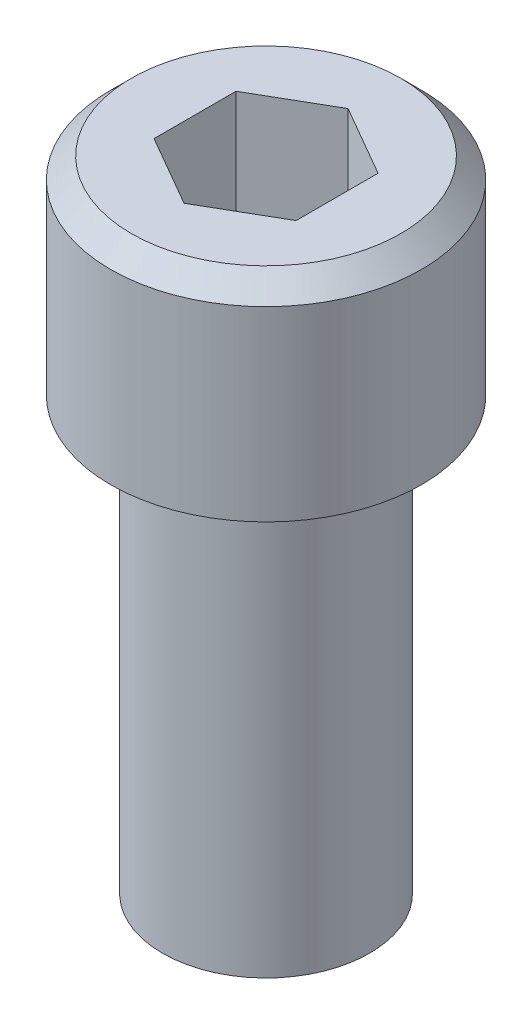
ISO-10303-21;
HEADER;
FILE_DESCRIPTION(('STEP AP214'),'2;1');
FILE_NAME('part.step','',(''),(''),'','','');
FILE_SCHEMA(('AUTOMOTIVE_DESIGN { 1 0 10303 214 1 1 1 1 }'));
ENDSEC;
DATA;
#1=APPLICATION_CONTEXT('core data for automotive mechanical design processes');
#2=APPLICATION_PROTOCOL_DEFINITION('international standard','automotive_design',2000,#1);
#3=PRODUCT_CONTEXT('',#1,'mechanical');
#4=PRODUCT('Part','Part','',(#3));
#5=PRODUCT_RELATED_PRODUCT_CATEGORY('part','',(#4));
#6=PRODUCT_DEFINITION_FORMATION('','',#4);
#7=PRODUCT_DEFINITION_CONTEXT('part definition',#1,'design');
#8=PRODUCT_DEFINITION('design','',#6,#7);
#9=PRODUCT_DEFINITION_SHAPE('','',#8);
#10=(LENGTH_UNIT() NAMED_UNIT(*) SI_UNIT(.MILLI.,.METRE.));
#11=(NAMED_UNIT(*) PLANE_ANGLE_UNIT() SI_UNIT($,.RADIAN.));
#12=(NAMED_UNIT(*) SI_UNIT($,.STERADIAN.) SOLID_ANGLE_UNIT());
#13=UNCERTAINTY_MEASURE_WITH_UNIT(LENGTH_MEASURE(1.E-05),#10,'distance_accuracy_value','');
#14=(GEOMETRIC_REPRESENTATION_CONTEXT(3) GLOBAL_UNCERTAINTY_ASSIGNED_CONTEXT((#13)) GLOBAL_UNIT_ASSIGNED_CONTEXT((#10,
#11,#12)) REPRESENTATION_CONTEXT('',''));
#15=CARTESIAN_POINT('',(0.,0.,0.));
#16=DIRECTION('',(0.,0.,1.));
#17=DIRECTION('',(1.,0.,0.));
#18=AXIS2_PLACEMENT_3D('',#15,#16,#17);
#19=CARTESIAN_POINT('',(0.,0.,0.));
#20=DIRECTION('',(0.,1.,0.));
#21=DIRECTION('',(0.,0.,1.));
#22=AXIS2_PLACEMENT_3D('',#19,#20,#21);
#23=PLANE('',#22);
#24=CARTESIAN_POINT('',(0.,0.,0.));
#25=DIRECTION('',(0.,1.,0.));
#26=DIRECTION('',(0.,0.,1.));
#27=AXIS2_PLACEMENT_3D('',#24,#25,#26);
#28=CIRCLE('',#27,18.);
#29=CARTESIAN_POINT('',(0.,0.,18.));
#30=VERTEX_POINT('',#29);
#31=EDGE_CURVE('E193',#30,#30,#28,.T.);
#32=ORIENTED_EDGE('',*,*,#31,.F.);
#33=EDGE_LOOP('',(#32));
#34=FACE_BOUND('',#33,.T.);
#35=CARTESIAN_POINT('',(0.,0.,0.));
#36=DIRECTION('',(0.,1.,0.));
#37=DIRECTION('',(0.,0.,1.));
#38=AXIS2_PLACEMENT_3D('',#35,#36,#37);
#39=CIRCLE('',#38,12.);
#40=CARTESIAN_POINT('',(0.,0.,12.));
#41=VERTEX_POINT('',#40);
#42=EDGE_CURVE('E11',#41,#41,#39,.F.);
#43=ORIENTED_EDGE('',*,*,#42,.F.);
#44=EDGE_LOOP('',(#43));
#45=FACE_BOUND('',#44,.T.);
#46=ADVANCED_FACE('F33',(#34,#45),#23,.F.);
#47=CARTESIAN_POINT('',(0.,24.,0.));
#48=DIRECTION('',(0.,1.,0.));
#49=DIRECTION('',(0.,0.,1.));
#50=AXIS2_PLACEMENT_3D('',#47,#48,#49);
#51=PLANE('',#50);
#52=CARTESIAN_POINT('',(0.,24.,0.));
#53=DIRECTION('',(0.,1.,0.));
#54=DIRECTION('',(0.,0.,1.));
#55=AXIS2_PLACEMENT_3D('',#52,#53,#54);
#56=CIRCLE('',#55,15.6);
#57=CARTESIAN_POINT('',(0.,24.,15.6));
#58=VERTEX_POINT('',#57);
#59=EDGE_CURVE('E106',#58,#58,#56,.T.);
#60=ORIENTED_EDGE('',*,*,#59,.T.);
#61=EDGE_LOOP('',(#60));
#62=FACE_BOUND('',#61,.T.);
#63=DIRECTION('',(-0.866025403784439,0.,0.5));
#64=VECTOR('',#63,1.);
#65=CARTESIAN_POINT('',(0.,24.,-9.5));
#66=LINE('',#65,#64);
#67=CARTESIAN_POINT('',(0.,24.,-9.5));
#68=VERTEX_POINT('',#67);
#69=CARTESIAN_POINT('',(-8.22724133595217,24.,-4.75));
#70=VERTEX_POINT('',#69);
#71=EDGE_CURVE('E169',#68,#70,#66,.T.);
#72=ORIENTED_EDGE('',*,*,#71,.F.);
#73=DIRECTION('',(-0.866025403784439,0.,-0.5));
#74=VECTOR('',#73,1.);
#75=CARTESIAN_POINT('',(8.22724133595217,24.,-4.75));
#76=LINE('',#75,#74);
#77=CARTESIAN_POINT('',(8.22724133595217,24.,-4.75));
#78=VERTEX_POINT('',#77);
#79=EDGE_CURVE('E167',#78,#68,#76,.T.);
#80=ORIENTED_EDGE('',*,*,#79,.F.);
#81=DIRECTION('',(0.,0.,-1.));
#82=VECTOR('',#81,1.);
#83=CARTESIAN_POINT('',(8.22724133595217,24.,4.75));
#84=LINE('',#83,#82);
#85=CARTESIAN_POINT('',(8.22724133595217,24.,4.75));
#86=VERTEX_POINT('',#85);
#87=EDGE_CURVE('E178',#86,#78,#84,.T.);
#88=ORIENTED_EDGE('',*,*,#87,.F.);
#89=DIRECTION('',(0.866025403784439,0.,-0.5));
#90=VECTOR('',#89,1.);
#91=CARTESIAN_POINT('',(0.,24.,9.5));
#92=LINE('',#91,#90);
#93=CARTESIAN_POINT('',(0.,24.,9.5));
#94=VERTEX_POINT('',#93);
#95=EDGE_CURVE('E175',#94,#86,#92,.T.);
#96=ORIENTED_EDGE('',*,*,#95,.F.);
#97=DIRECTION('',(0.866025403784439,0.,0.5));
#98=VECTOR('',#97,1.);
#99=CARTESIAN_POINT('',(-8.22724133595217,24.,4.75));
#100=LINE('',#99,#98);
#101=CARTESIAN_POINT('',(-8.22724133595217,24.,4.75));
#102=VERTEX_POINT('',#101);
#103=EDGE_CURVE('E173',#102,#94,#100,.T.);
#104=ORIENTED_EDGE('',*,*,#103,.F.);
#105=DIRECTION('',(0.,0.,1.));
#106=VECTOR('',#105,1.);
#107=CARTESIAN_POINT('',(-8.22724133595217,24.,-4.75));
#108=LINE('',#107,#106);
#109=EDGE_CURVE('E171',#70,#102,#108,.T.);
#110=ORIENTED_EDGE('',*,*,#109,.F.);
#111=EDGE_LOOP('',(#72,#80,#88,#96,#104,#110));
#112=FACE_BOUND('',#111,.T.);
#113=ADVANCED_FACE('F161',(#62,#112),#51,.T.);
#114=CARTESIAN_POINT('',(0.,24.,0.));
#115=DIRECTION('',(0.,-1.,0.));
#116=DIRECTION('',(0.,0.,-1.));
#117=AXIS2_PLACEMENT_3D('',#114,#115,#116);
#118=CYLINDRICAL_SURFACE('',#117,18.);
#119=CARTESIAN_POINT('',(0.,21.6,0.));
#120=DIRECTION('',(0.,1.,0.));
#121=DIRECTION('',(0.,0.,1.));
#122=AXIS2_PLACEMENT_3D('',#119,#120,#121);
#123=CIRCLE('',#122,18.);
#124=CARTESIAN_POINT('',(0.,21.6,18.));
#125=VERTEX_POINT('',#124);
#126=EDGE_CURVE('E104',#125,#125,#123,.F.);
#127=ORIENTED_EDGE('',*,*,#126,.T.);
#128=EDGE_LOOP('',(#127));
#129=FACE_BOUND('',#128,.T.);
#130=ORIENTED_EDGE('',*,*,#31,.T.);
#131=EDGE_LOOP('',(#130));
#132=FACE_BOUND('',#131,.T.);
#133=ADVANCED_FACE('F159',(#129,#132),#118,.T.);
#134=CARTESIAN_POINT('',(8.22724133595217,24.,-4.75));
#135=DIRECTION('',(-0.5,0.,0.866025403784439));
#136=DIRECTION('',(0.866025403784439,0.,0.5));
#137=AXIS2_PLACEMENT_3D('',#134,#135,#136);
#138=PLANE('',#137);
#139=CARTESIAN_POINT('',(8.22744133595217,12.0000666678821,-4.74988452994616));
#140=CARTESIAN_POINT('',(8.04659758583466,11.9397948671262,-4.85429471775777));
#141=CARTESIAN_POINT('',(7.86507958622392,11.8822584416015,-4.95909418369579));
#142=CARTESIAN_POINT('',(7.50056942295557,11.7734097386162,-5.16954422458113));
#143=CARTESIAN_POINT('',(7.31757665905111,11.7221001477923,-5.27519514608112));
#144=CARTESIAN_POINT('',(6.76566843893082,11.578518859269,-5.59383950553554));
#145=CARTESIAN_POINT('',(6.39457435644526,11.4968517102731,-5.80809077395326));
#146=CARTESIAN_POINT('',(5.83923923489461,11.4010873747825,-6.12871365587097));
#147=CARTESIAN_POINT('',(5.65665723938216,11.3738068904218,-6.23412742012927));
#148=CARTESIAN_POINT('',(5.29066756080364,11.3280621549001,-6.4454316595772));
#149=CARTESIAN_POINT('',(5.10725995213686,11.309597124785,-6.55132209181239));
#150=CARTESIAN_POINT('',(4.7401289375152,11.2819512654669,-6.76328528193206));
#151=CARTESIAN_POINT('',(4.5564061280416,11.2727599000124,-6.86935769543792));
#152=CARTESIAN_POINT('',(4.18879079055541,11.2638584224413,-7.08160050949381));
#153=CARTESIAN_POINT('',(4.00489826796174,11.2641480174048,-7.18777090691522));
#154=CARTESIAN_POINT('',(3.66110464437688,11.2735490043022,-7.38626024803762));
#155=CARTESIAN_POINT('',(3.5011792823305,11.2815136047913,-7.47859319886534));
#156=CARTESIAN_POINT('',(3.18170312063848,11.3044589304397,-7.6630428468179));
#157=CARTESIAN_POINT('',(3.02215234697069,11.3194401285533,-7.75515952894442));
#158=CARTESIAN_POINT('',(2.54411771125834,11.3745545023655,-8.0311529545549));
#159=CARTESIAN_POINT('',(2.22648001075275,11.4248515749206,-8.21454116644658));
#160=CARTESIAN_POINT('',(1.58783516770009,11.5505950920653,-8.5832629384996));
#161=CARTESIAN_POINT('',(1.26690953264391,11.6265745612511,-8.76854944028914));
#162=CARTESIAN_POINT('',(0.629844109224194,11.7990165466259,-9.13635933399191));
#163=CARTESIAN_POINT('',(0.313696162655308,11.8954385604423,-9.31888743604721));
#164=CARTESIAN_POINT('',(-0.000200000000000182,12.0000666678821,-9.50011547005384));
#165=B_SPLINE_CURVE_WITH_KNOTS('',3,(#139,#140,#141,#142,#143,#144,#145,#146,#147,#148,#149,
#150,#151,#152,#153,#154,#155,#156,#157,#158,#159,#160,#161,#162,#163,#164),.UNSPECIFIED.,.F.,
.F.,(4,2,2,2,2,2,2,2,2,2,2,2,4),(0.,0.651981443680323,1.30424319931677,2.61147679303848,
3.24908400419041,3.88663486446454,4.52346055445683,5.16026656936256,5.71464112370344,
6.2690530510783,7.37866663979238,8.5128892932208,9.64488539256863),.UNSPECIFIED.);
#166=CARTESIAN_POINT('',(8.22724133595217,12.,-4.75));
#167=VERTEX_POINT('',#166);
#168=CARTESIAN_POINT('',(0.,12.,-9.5));
#169=VERTEX_POINT('',#168);
#170=EDGE_CURVE('E99',#167,#169,#165,.T.);
#171=ORIENTED_EDGE('',*,*,#170,.F.);
#172=DIRECTION('',(0.,-1.,0.));
#173=VECTOR('',#172,1.);
#174=CARTESIAN_POINT('',(8.22724133595217,24.,-4.75));
#175=LINE('',#174,#173);
#176=EDGE_CURVE('E180',#78,#167,#175,.T.);
#177=ORIENTED_EDGE('',*,*,#176,.F.);
#178=ORIENTED_EDGE('',*,*,#79,.T.);
#179=DIRECTION('',(0.,-1.,0.));
#180=VECTOR('',#179,1.);
#181=CARTESIAN_POINT('',(0.,24.,-9.5));
#182=LINE('',#181,#180);
#183=EDGE_CURVE('E191',#68,#169,#182,.T.);
#184=ORIENTED_EDGE('',*,*,#183,.T.);
#185=EDGE_LOOP('',(#171,#177,#178,#184));
#186=FACE_BOUND('',#185,.T.);
#187=ADVANCED_FACE('F155',(#186),#138,.T.);
#188=CARTESIAN_POINT('',(0.,24.,-9.5));
#189=DIRECTION('',(0.5,0.,0.866025403784439));
#190=DIRECTION('',(0.866025403784439,0.,-0.5));
#191=AXIS2_PLACEMENT_3D('',#188,#189,#190);
#192=PLANE('',#191);
#193=CARTESIAN_POINT('',(0.000199999999999615,12.0000666678821,-9.50011547005384));
#194=CARTESIAN_POINT('',(-0.180643750117506,11.9397948671262,-9.39570528224224));
#195=CARTESIAN_POINT('',(-0.362161749728251,11.8822584416015,-9.29090581630421));
#196=CARTESIAN_POINT('',(-0.726671912996597,11.7734097386162,-9.08045577541887));
#197=CARTESIAN_POINT('',(-0.909664676901062,11.7221001477923,-8.97480485391888));
#198=CARTESIAN_POINT('',(-1.46157289702135,11.578518859269,-8.65616049446446));
#199=CARTESIAN_POINT('',(-1.83266697950691,11.4968517102731,-8.44190922604675));
#200=CARTESIAN_POINT('',(-2.38800210105755,11.4010873747825,-8.12128634412903));
#201=CARTESIAN_POINT('',(-2.57058409657001,11.3738068904218,-8.01587257987073));
#202=CARTESIAN_POINT('',(-2.93657377514853,11.3280621549001,-7.8045683404228));
#203=CARTESIAN_POINT('',(-3.1199813838153,11.309597124785,-7.69867790818761));
#204=CARTESIAN_POINT('',(-3.48711239843696,11.2819512654669,-7.48671471806794));
#205=CARTESIAN_POINT('',(-3.67083520791056,11.2727599000124,-7.38064230456208));
#206=CARTESIAN_POINT('',(-4.03845054539675,11.2638584224413,-7.16839949050619));
#207=CARTESIAN_POINT('',(-4.22234306799043,11.2641480174048,-7.06222909308478));
#208=CARTESIAN_POINT('',(-4.56613669157529,11.2735490043022,-6.86373975196238));
#209=CARTESIAN_POINT('',(-4.72606205362167,11.2815136047913,-6.77140680113466));
#210=CARTESIAN_POINT('',(-5.04553821531369,11.3044589304397,-6.5869571531821));
#211=CARTESIAN_POINT('',(-5.20508898898148,11.3194401285533,-6.49484047105559));
#212=CARTESIAN_POINT('',(-5.68312362469383,11.3745545023655,-6.2188470454451));
#213=CARTESIAN_POINT('',(-6.00076132519942,11.4248515749206,-6.03545883355342));
#214=CARTESIAN_POINT('',(-6.63940616825207,11.5505950920653,-5.66673706150041));
#215=CARTESIAN_POINT('',(-6.96033180330825,11.6265745612511,-5.48145055971087));
#216=CARTESIAN_POINT('',(-7.59739722672797,11.7990165466259,-5.11364066600809));
#217=CARTESIAN_POINT('',(-7.91354517329686,11.8954385604423,-4.9311125639528));
#218=CARTESIAN_POINT('',(-8.22744133595217,12.0000666678821,-4.74988452994616));
#219=B_SPLINE_CURVE_WITH_KNOTS('',3,(#193,#194,#195,#196,#197,#198,#199,#200,#201,#202,#203,
#204,#205,#206,#207,#208,#209,#210,#211,#212,#213,#214,#215,#216,#217,#218),.UNSPECIFIED.,.F.,
.F.,(4,2,2,2,2,2,2,2,2,2,2,2,4),(0.,0.651981443680322,1.30424319931677,2.61147679303848,
3.24908400419041,3.88663486446454,4.52346055445683,5.16026656936255,5.71464112370344,
6.2690530510783,7.37866663979238,8.5128892932208,9.64488539256862),.UNSPECIFIED.);
#220=CARTESIAN_POINT('',(-8.22724133595217,12.,-4.75));
#221=VERTEX_POINT('',#220);
#222=EDGE_CURVE('E48',#169,#221,#219,.T.);
#223=ORIENTED_EDGE('',*,*,#222,.F.);
#224=ORIENTED_EDGE('',*,*,#183,.F.);
#225=ORIENTED_EDGE('',*,*,#71,.T.);
#226=DIRECTION('',(0.,-1.,0.));
#227=VECTOR('',#226,1.);
#228=CARTESIAN_POINT('',(-8.22724133595217,24.,-4.75));
#229=LINE('',#228,#227);
#230=EDGE_CURVE('E189',#70,#221,#229,.T.);
#231=ORIENTED_EDGE('',*,*,#230,.T.);
#232=EDGE_LOOP('',(#223,#224,#225,#231));
#233=FACE_BOUND('',#232,.T.);
#234=ADVANCED_FACE('F151',(#233),#192,.T.);
#235=CARTESIAN_POINT('',(-8.22724133595217,24.,-4.75));
#236=DIRECTION('',(1.,0.,0.));
#237=DIRECTION('',(0.,0.,-1.));
#238=AXIS2_PLACEMENT_3D('',#235,#236,#237);
#239=PLANE('',#238);
#240=CARTESIAN_POINT('',(-8.22724133595217,15.0591786598063,-12.3009197507311));
#241=CARTESIAN_POINT('',(-8.22724133595217,14.8887284634204,-11.9456391255625));
#242=CARTESIAN_POINT('',(-8.22724133595217,14.7200486977412,-11.589492996995));
#243=CARTESIAN_POINT('',(-8.22724133595217,14.3872343724134,-10.8750084325189));
#244=CARTESIAN_POINT('',(-8.22724133595217,14.2231006305902,-10.5166696161237));
#245=CARTESIAN_POINT('',(-8.22724133595217,13.8994657493544,-9.79528374053409));
#246=CARTESIAN_POINT('',(-8.22724133595217,13.7399987510733,-9.4322213066883));
#247=CARTESIAN_POINT('',(-8.22724133595217,13.4282156380862,-8.70304991591352));
#248=CARTESIAN_POINT('',(-8.22724133595217,13.2758991517953,-8.33694111845905));
#249=CARTESIAN_POINT('',(-8.22724133595217,12.9764426168056,-7.59145033574089));
#250=CARTESIAN_POINT('',(-8.22724133595217,12.8295420329299,-7.21197158481871));
#251=CARTESIAN_POINT('',(-8.22724133595217,12.5479541645643,-6.44842506321989));
#252=CARTESIAN_POINT('',(-8.22724133595217,12.4132682955595,-6.06435676651184));
#253=CARTESIAN_POINT('',(-8.22724133595217,12.1599565589819,-5.29188533357242));
#254=CARTESIAN_POINT('',(-8.22724133595217,12.0412942292182,-4.90349429282243));
#255=CARTESIAN_POINT('',(-8.22724133595217,11.8241019037623,-4.12119443583158));
#256=CARTESIAN_POINT('',(-8.22724133595217,11.7255651416578,-3.72728752183332));
#257=CARTESIAN_POINT('',(-8.22724133595217,11.5538694563415,-2.93465827885932));
#258=CARTESIAN_POINT('',(-8.22724133595217,11.4806595077934,-2.53594732644425));
#259=CARTESIAN_POINT('',(-8.22724133595217,11.3934417934303,-1.93462794536727));
#260=CARTESIAN_POINT('',(-8.22724133595217,11.3681341802484,-1.73362800697877));
#261=CARTESIAN_POINT('',(-8.22724133595217,11.325554290715,-1.33078511233158));
#262=CARTESIAN_POINT('',(-8.22724133595217,11.3082812560353,-1.12894223744693));
#263=CARTESIAN_POINT('',(-8.22724133595217,11.2823103344712,-0.727117243846923));
#264=CARTESIAN_POINT('',(-8.22724133595217,11.2735128003296,-0.527141582786325));
#265=CARTESIAN_POINT('',(-8.22724133595217,11.2643361259884,-0.126998512674683));
#266=CARTESIAN_POINT('',(-8.22724133595217,11.2639568598513,0.0731688934630473));
#267=CARTESIAN_POINT('',(-8.22724133595217,11.2716266074877,0.473348717467973));
#268=CARTESIAN_POINT('',(-8.22724133595217,11.2796759016805,0.673361129956946));
#269=CARTESIAN_POINT('',(-8.22724133595217,11.3040171274448,1.07288692474318));
#270=CARTESIAN_POINT('',(-8.22724133595217,11.3203095194242,1.27240027854057));
#271=CARTESIAN_POINT('',(-8.22724133595217,11.3704609741616,1.76572005500452));
#272=CARTESIAN_POINT('',(-8.22724133595217,11.4089934078833,2.0590585912313));
#273=CARTESIAN_POINT('',(-8.22724133595217,11.5016656260398,2.64326243725704));
#274=CARTESIAN_POINT('',(-8.22724133595217,11.5558079168838,2.93412734214796));
#275=CARTESIAN_POINT('',(-8.22724133595217,11.6777731469456,3.51320432611751));
#276=CARTESIAN_POINT('',(-8.22724133595217,11.7456076270674,3.80141395138043));
#277=CARTESIAN_POINT('',(-8.22724133595217,11.8929194252481,4.37480685399982));
#278=CARTESIAN_POINT('',(-8.22724133595217,11.9723964582721,4.65999020526278));
#279=CARTESIAN_POINT('',(-8.22724133595217,12.1430261727988,5.23378947170449));
#280=CARTESIAN_POINT('',(-8.22724133595217,12.2344006896767,5.52233897615086));
#281=CARTESIAN_POINT('',(-8.22724133595217,12.4256421604238,6.09659489284183));
#282=CARTESIAN_POINT('',(-8.22724133595217,12.5255091752557,6.38230128466094));
#283=CARTESIAN_POINT('',(-8.22724133595217,12.7322337286296,6.95103239117513));
#284=CARTESIAN_POINT('',(-8.22724133595217,12.8390884413958,7.23405813754116));
#285=CARTESIAN_POINT('',(-8.22724133595217,13.0586251675436,7.79782576329922));
#286=CARTESIAN_POINT('',(-8.22724133595217,13.1713070848104,8.07856768027274));
#287=CARTESIAN_POINT('',(-8.22724133595217,13.4661633253112,8.79519617212212));
#288=CARTESIAN_POINT('',(-8.22724133595216,13.6518187459867,9.22964906252726));
#289=CARTESIAN_POINT('',(-8.22724133595216,14.0320602652102,10.0946410178824));
#290=CARTESIAN_POINT('',(-8.22724133595216,14.2266470367475,10.5251797849599));
#291=CARTESIAN_POINT('',(-8.22724133595216,14.6227438479294,11.3831895968714));
#292=CARTESIAN_POINT('',(-8.22724133595216,14.824255698393,11.810659803444));
#293=CARTESIAN_POINT('',(-8.22724133595216,15.2326418981969,12.6630095512729));
#294=CARTESIAN_POINT('',(-8.22724133595216,15.4395161011506,13.0878891628594));
#295=CARTESIAN_POINT('',(-8.22724133595216,15.8577719762012,13.9360565286181));
#296=CARTESIAN_POINT('',(-8.22724133595216,16.069158777208,14.3593417491042));
#297=CARTESIAN_POINT('',(-8.22724133595216,16.495361206445,15.2041829106485));
#298=CARTESIAN_POINT('',(-8.22724133595216,16.7101768537924,15.6257388420489));
#299=CARTESIAN_POINT('',(-8.22724133595216,17.1425638334269,16.4673523270751));
#300=CARTESIAN_POINT('',(-8.22724133595216,17.3601347403053,16.8874100994827));
#301=CARTESIAN_POINT('',(-8.22724133595216,17.7975751336997,17.7263276937239));
#302=CARTESIAN_POINT('',(-8.22724133595216,18.0174446277573,18.1451875116214));
#303=CARTESIAN_POINT('',(-8.22724133595216,18.6382220359072,19.3212872542941));
#304=CARTESIAN_POINT('',(-8.22724133595216,19.0412989633834,20.0773821619132));
#305=CARTESIAN_POINT('',(-8.22724133595216,19.8520371642811,21.5871464922061));
#306=CARTESIAN_POINT('',(-8.22724133595216,20.2596986321206,22.3408158102608));
#307=CARTESIAN_POINT('',(-8.22724133595216,21.0774237639322,23.8443653428611));
#308=CARTESIAN_POINT('',(-8.22724133595216,21.4874786804587,24.5942503192077));
#309=CARTESIAN_POINT('',(-8.22724133595216,22.3102551677517,26.0925001284747));
#310=CARTESIAN_POINT('',(-8.22724133595216,22.7229765831927,26.8408650466606));
#311=CARTESIAN_POINT('',(-8.22724133595216,23.1366753233286,27.5886856162518));
#312=B_SPLINE_CURVE_WITH_KNOTS('',3,(#240,#241,#242,#243,#244,#245,#246,#247,#248,#249,#250,
#251,#252,#253,#254,#255,#256,#257,#258,#259,#260,#261,#262,#263,#264,#265,#266,#267,#268,#269,
#270,#271,#272,#273,#274,#275,#276,#277,#278,#279,#280,#281,#282,#283,#284,#285,#286,#287,#288,
#289,#290,#291,#292,#293,#294,#295,#296,#297,#298,#299,#300,#301,#302,#303,#304,#305,#306,#307,
#308,#309,#310,#311),.UNSPECIFIED.,.F.,.F.,(4,2,2,2,2,2,2,2,2,2,2,2,2,2,2,2,2,2,2,2,2,2,2,2,2,2,
2,2,2,2,2,2,2,2,2,4),(0.,1.18217512417241,2.36456155706219,3.55412038916152,4.74361733581756,
5.96421451731249,7.18495296575287,8.40286500142138,9.62036688668276,10.8354014163064,
11.4430265610028,12.0505943445191,12.6509284223373,13.2512535191324,13.8515985894499,
14.4519771949783,15.3390523988871,16.2262701161307,17.1142387999396,18.0021857479768,
18.9100423248042,19.8179054191516,20.7254036236085,21.6328868644207,23.0501172012077,
24.4674545040722,25.8851652853797,27.3028374053799,28.7222170409812,30.1416045930036,
31.5607756024617,32.9799512696588,35.5504045262371,38.1209672030327,40.6849915746167,
43.2488679128633),.UNSPECIFIED.);
#313=CARTESIAN_POINT('',(-8.22724133595217,12.,4.75));
#314=VERTEX_POINT('',#313);
#315=EDGE_CURVE('E56',#221,#314,#312,.T.);
#316=ORIENTED_EDGE('',*,*,#315,.F.);
#317=ORIENTED_EDGE('',*,*,#230,.F.);
#318=ORIENTED_EDGE('',*,*,#109,.T.);
#319=DIRECTION('',(0.,-1.,0.));
#320=VECTOR('',#319,1.);
#321=CARTESIAN_POINT('',(-8.22724133595217,24.,4.75));
#322=LINE('',#321,#320);
#323=EDGE_CURVE('E187',#102,#314,#322,.T.);
#324=ORIENTED_EDGE('',*,*,#323,.T.);
#325=EDGE_LOOP('',(#316,#317,#318,#324));
#326=FACE_BOUND('',#325,.T.);
#327=ADVANCED_FACE('F148',(#326),#239,.T.);
#328=CARTESIAN_POINT('',(-8.22724133595217,24.,4.75));
#329=DIRECTION('',(0.5,0.,-0.866025403784439));
#330=DIRECTION('',(-0.866025403784439,0.,-0.5));
#331=AXIS2_PLACEMENT_3D('',#328,#329,#330);
#332=PLANE('',#331);
#333=CARTESIAN_POINT('',(-8.22744133595217,12.0000666678821,4.74988452994616));
#334=CARTESIAN_POINT('',(-8.04659758583466,11.9397948671262,4.85429471775777));
#335=CARTESIAN_POINT('',(-7.86507958622391,11.8822584416015,4.95909418369579));
#336=CARTESIAN_POINT('',(-7.50056942295557,11.7734097386162,5.16954422458113));
#337=CARTESIAN_POINT('',(-7.3175766590511,11.7221001477923,5.27519514608112));
#338=CARTESIAN_POINT('',(-6.76566843893082,11.578518859269,5.59383950553554));
#339=CARTESIAN_POINT('',(-6.39457435644526,11.4968517102731,5.80809077395325));
#340=CARTESIAN_POINT('',(-5.83923923489461,11.4010873747825,6.12871365587097));
#341=CARTESIAN_POINT('',(-5.65665723938216,11.3738068904218,6.23412742012927));
#342=CARTESIAN_POINT('',(-5.29066756080364,11.3280621549001,6.4454316595772));
#343=CARTESIAN_POINT('',(-5.10725995213686,11.309597124785,6.55132209181239));
#344=CARTESIAN_POINT('',(-4.7401289375152,11.2819512654669,6.76328528193206));
#345=CARTESIAN_POINT('',(-4.5564061280416,11.2727599000124,6.86935769543792));
#346=CARTESIAN_POINT('',(-4.18879079055541,11.2638584224413,7.08160050949381));
#347=CARTESIAN_POINT('',(-4.00489826796174,11.2641480174048,7.18777090691522));
#348=CARTESIAN_POINT('',(-3.66110464437688,11.2735490043022,7.38626024803762));
#349=CARTESIAN_POINT('',(-3.5011792823305,11.2815136047913,7.47859319886534));
#350=CARTESIAN_POINT('',(-3.18170312063848,11.3044589304397,7.6630428468179));
#351=CARTESIAN_POINT('',(-3.02215234697069,11.3194401285533,7.75515952894441));
#352=CARTESIAN_POINT('',(-2.54411771125834,11.3745545023655,8.0311529545549));
#353=CARTESIAN_POINT('',(-2.22648001075275,11.4248515749206,8.21454116644658));
#354=CARTESIAN_POINT('',(-1.58783516770009,11.5505950920653,8.5832629384996));
#355=CARTESIAN_POINT('',(-1.26690953264391,11.6265745612511,8.76854944028913));
#356=CARTESIAN_POINT('',(-0.629844109224194,11.7990165466259,9.13635933399191));
#357=CARTESIAN_POINT('',(-0.313696162655308,11.8954385604423,9.31888743604721));
#358=CARTESIAN_POINT('',(0.0002000000000002,12.0000666678821,9.50011547005384));
#359=B_SPLINE_CURVE_WITH_KNOTS('',3,(#333,#334,#335,#336,#337,#338,#339,#340,#341,#342,#343,
#344,#345,#346,#347,#348,#349,#350,#351,#352,#353,#354,#355,#356,#357,#358),.UNSPECIFIED.,.F.,
.F.,(4,2,2,2,2,2,2,2,2,2,2,2,4),(0.,0.651981443680322,1.30424319931677,2.61147679303848,
3.24908400419041,3.88663486446454,4.52346055445683,5.16026656936255,5.71464112370344,
6.2690530510783,7.37866663979238,8.5128892932208,9.64488539256863),.UNSPECIFIED.);
#360=CARTESIAN_POINT('',(0.,12.,9.5));
#361=VERTEX_POINT('',#360);
#362=EDGE_CURVE('E133',#314,#361,#359,.T.);
#363=ORIENTED_EDGE('',*,*,#362,.F.);
#364=ORIENTED_EDGE('',*,*,#323,.F.);
#365=ORIENTED_EDGE('',*,*,#103,.T.);
#366=DIRECTION('',(0.,-1.,0.));
#367=VECTOR('',#366,1.);
#368=CARTESIAN_POINT('',(0.,24.,9.5));
#369=LINE('',#368,#367);
#370=EDGE_CURVE('E184',#94,#361,#369,.T.);
#371=ORIENTED_EDGE('',*,*,#370,.T.);
#372=EDGE_LOOP('',(#363,#364,#365,#371));
#373=FACE_BOUND('',#372,.T.);
#374=ADVANCED_FACE('F123',(#373),#332,.T.);
#375=CARTESIAN_POINT('',(0.,24.,9.5));
#376=DIRECTION('',(-0.5,0.,-0.866025403784439));
#377=DIRECTION('',(-0.866025403784439,0.,0.5));
#378=AXIS2_PLACEMENT_3D('',#375,#376,#377);
#379=PLANE('',#378);
#380=CARTESIAN_POINT('',(-0.000199999999999968,12.0000666678821,9.50011547005384));
#381=CARTESIAN_POINT('',(0.180643750117506,11.9397948671262,9.39570528224224));
#382=CARTESIAN_POINT('',(0.362161749728251,11.8822584416015,9.29090581630421));
#383=CARTESIAN_POINT('',(0.726671912996596,11.7734097386162,9.08045577541887));
#384=CARTESIAN_POINT('',(0.909664676901061,11.7221001477923,8.97480485391888));
#385=CARTESIAN_POINT('',(1.46157289702135,11.578518859269,8.65616049446446));
#386=CARTESIAN_POINT('',(1.83266697950691,11.4968517102731,8.44190922604675));
#387=CARTESIAN_POINT('',(2.38800210105755,11.4010873747825,8.12128634412903));
#388=CARTESIAN_POINT('',(2.57058409657001,11.3738068904218,8.01587257987073));
#389=CARTESIAN_POINT('',(2.93657377514853,11.3280621549001,7.8045683404228));
#390=CARTESIAN_POINT('',(3.1199813838153,11.309597124785,7.69867790818761));
#391=CARTESIAN_POINT('',(3.48711239843696,11.2819512654669,7.48671471806794));
#392=CARTESIAN_POINT('',(3.67083520791056,11.2727599000124,7.38064230456208));
#393=CARTESIAN_POINT('',(4.03845054539675,11.2638584224413,7.16839949050619));
#394=CARTESIAN_POINT('',(4.22234306799043,11.2641480174048,7.06222909308478));
#395=CARTESIAN_POINT('',(4.56613669157529,11.2735490043022,6.86373975196238));
#396=CARTESIAN_POINT('',(4.72606205362167,11.2815136047913,6.77140680113466));
#397=CARTESIAN_POINT('',(5.04553821531369,11.3044589304397,6.5869571531821));
#398=CARTESIAN_POINT('',(5.20508898898148,11.3194401285533,6.49484047105559));
#399=CARTESIAN_POINT('',(5.68312362469383,11.3745545023655,6.2188470454451));
#400=CARTESIAN_POINT('',(6.00076132519942,11.4248515749206,6.03545883355342));
#401=CARTESIAN_POINT('',(6.63940616825207,11.5505950920653,5.6667370615004));
#402=CARTESIAN_POINT('',(6.96033180330826,11.6265745612511,5.48145055971087));
#403=CARTESIAN_POINT('',(7.59739722672798,11.7990165466259,5.11364066600809));
#404=CARTESIAN_POINT('',(7.91354517329686,11.8954385604423,4.9311125639528));
#405=CARTESIAN_POINT('',(8.22744133595217,12.0000666678821,4.74988452994616));
#406=B_SPLINE_CURVE_WITH_KNOTS('',3,(#380,#381,#382,#383,#384,#385,#386,#387,#388,#389,#390,
#391,#392,#393,#394,#395,#396,#397,#398,#399,#400,#401,#402,#403,#404,#405),.UNSPECIFIED.,.F.,
.F.,(4,2,2,2,2,2,2,2,2,2,2,2,4),(0.,0.651981443680322,1.30424319931677,2.61147679303848,
3.24908400419041,3.88663486446454,4.52346055445683,5.16026656936256,5.71464112370344,
6.2690530510783,7.37866663979238,8.5128892932208,9.64488539256863),.UNSPECIFIED.);
#407=CARTESIAN_POINT('',(8.22724133595217,12.,4.75));
#408=VERTEX_POINT('',#407);
#409=EDGE_CURVE('E101',#361,#408,#406,.T.);
#410=ORIENTED_EDGE('',*,*,#409,.F.);
#411=ORIENTED_EDGE('',*,*,#370,.F.);
#412=ORIENTED_EDGE('',*,*,#95,.T.);
#413=DIRECTION('',(0.,-1.,0.));
#414=VECTOR('',#413,1.);
#415=CARTESIAN_POINT('',(8.22724133595217,24.,4.75));
#416=LINE('',#415,#414);
#417=EDGE_CURVE('E182',#86,#408,#416,.T.);
#418=ORIENTED_EDGE('',*,*,#417,.T.);
#419=EDGE_LOOP('',(#410,#411,#412,#418));
#420=FACE_BOUND('',#419,.T.);
#421=ADVANCED_FACE('F119',(#420),#379,.T.);
#422=CARTESIAN_POINT('',(8.22724133595217,24.,4.75));
#423=DIRECTION('',(-1.,0.,0.));
#424=DIRECTION('',(0.,0.,1.));
#425=AXIS2_PLACEMENT_3D('',#422,#423,#424);
#426=PLANE('',#425);
#427=CARTESIAN_POINT('',(8.22724133595217,15.059178657683,-12.3009197463068));
#428=CARTESIAN_POINT('',(8.22724133595217,14.8887284613886,-11.9456391212894));
#429=CARTESIAN_POINT('',(8.22724133595217,14.7200486958009,-11.5894929928732));
#430=CARTESIAN_POINT('',(8.22724133595217,14.3872343706554,-10.8750084287003));
#431=CARTESIAN_POINT('',(8.22724133595217,14.223100628923,-10.516669612457));
#432=CARTESIAN_POINT('',(8.22724133595217,13.8994657478692,-9.79528373717397));
#433=CARTESIAN_POINT('',(8.22724133595217,13.739998749679,-9.43222130348295));
#434=CARTESIAN_POINT('',(8.22724133595217,13.4282156368722,-8.70304991301892));
#435=CARTESIAN_POINT('',(8.22724133595217,13.2758991506705,-8.33694111572044));
#436=CARTESIAN_POINT('',(8.22724133595217,12.9764426158598,-7.59145033332332));
#437=CARTESIAN_POINT('',(8.22724133595217,12.8295420320738,-7.21197158256629));
#438=CARTESIAN_POINT('',(8.22724133595217,12.547954163882,-6.44842506130068));
#439=CARTESIAN_POINT('',(8.22724133595217,12.4132682949614,-6.06435676476071));
#440=CARTESIAN_POINT('',(8.22724133595217,12.1599565585428,-5.29188533216062));
#441=CARTESIAN_POINT('',(8.22724133595217,12.0412942288541,-4.90349429158186));
#442=CARTESIAN_POINT('',(8.22724133595217,11.824101903534,-4.1211944349383));
#443=CARTESIAN_POINT('',(8.22724133595217,11.7255651414905,-3.72728752111607));
#444=CARTESIAN_POINT('',(8.22724133595217,11.5538694562861,-2.93465827854893));
#445=CARTESIAN_POINT('',(8.22724133595217,11.4806595077859,-2.53594732636538));
#446=CARTESIAN_POINT('',(8.22724133595217,11.3934417934678,-1.93462794563921));
#447=CARTESIAN_POINT('',(8.22724133595217,11.3681341802963,-1.7336280073682));
#448=CARTESIAN_POINT('',(8.22724133595217,11.3255542907743,-1.33078511295673));
#449=CARTESIAN_POINT('',(8.22724133595217,11.3082812560953,-1.12894223819032));
#450=CARTESIAN_POINT('',(8.22724133595217,11.2823103345225,-0.727117244824396));
#451=CARTESIAN_POINT('',(8.22724133595217,11.2735128003716,-0.527141583879642));
#452=CARTESIAN_POINT('',(8.22724133595217,11.2643361260018,-0.126998513999205));
#453=CARTESIAN_POINT('',(8.22724133595217,11.2639568598455,0.0731688920231666));
#454=CARTESIAN_POINT('',(8.22724133595217,11.2716266074339,0.473348715798405));
#455=CARTESIAN_POINT('',(8.22724133595217,11.2796759015979,0.67336112817305));
#456=CARTESIAN_POINT('',(8.22724133595217,11.3040171272961,1.07288692273223));
#457=CARTESIAN_POINT('',(8.22724133595217,11.3203095192381,1.27240027641689));
#458=CARTESIAN_POINT('',(8.22724133595217,11.3704609738829,1.76572005269589));
#459=CARTESIAN_POINT('',(8.22724133595217,11.4089934075503,2.05905858885108));
#460=CARTESIAN_POINT('',(8.22724133595217,11.5016656255953,2.64326243473652));
#461=CARTESIAN_POINT('',(8.22724133595217,11.555807916382,2.93412733955874));
#462=CARTESIAN_POINT('',(8.22724133595217,11.6777731463282,3.51320432339306));
#463=CARTESIAN_POINT('',(8.22724133595217,11.7456076263916,3.80141394858948));
#464=CARTESIAN_POINT('',(8.22724133595217,11.892919424456,4.37480685107746));
#465=CARTESIAN_POINT('',(8.22724133595217,11.972396457422,4.65999020227553));
#466=CARTESIAN_POINT('',(8.22724133595217,12.1430261718323,5.23378946858574));
#467=CARTESIAN_POINT('',(8.22724133595217,12.2344006886516,5.52233897296555));
#468=CARTESIAN_POINT('',(8.22724133595217,12.4256421592831,6.09659488952395));
#469=CARTESIAN_POINT('',(8.22724133595217,12.525509174058,6.38230128127707));
#470=CARTESIAN_POINT('',(8.22724133595217,12.7322337273195,6.95103238765963));
#471=CARTESIAN_POINT('',(8.22724133595217,12.8390884400303,7.23405813396003));
#472=CARTESIAN_POINT('',(8.22724133595217,13.058625166069,7.79782575958681));
#473=CARTESIAN_POINT('',(8.22724133595217,13.171307083282,8.07856767649469));
#474=CARTESIAN_POINT('',(8.22724133595217,13.4661633236981,8.79519616830052));
#475=CARTESIAN_POINT('',(8.22724133595217,13.6518187443471,9.22964905872628));
#476=CARTESIAN_POINT('',(8.22724133595217,14.0320602635251,10.0946410141201));
#477=CARTESIAN_POINT('',(8.22724133595217,14.2266470350433,10.5251797812156));
#478=CARTESIAN_POINT('',(8.22724133595217,14.6227438461924,11.3831895931614));
#479=CARTESIAN_POINT('',(8.22724133595217,14.8242556966423,11.8106597997501));
#480=CARTESIAN_POINT('',(8.22724133595217,15.2326418964226,12.6630095476097));
#481=CARTESIAN_POINT('',(8.22724133595217,15.4395160993666,13.0878891592108));
#482=CARTESIAN_POINT('',(8.22724133595217,15.8577719744007,13.9360565249979));
#483=CARTESIAN_POINT('',(8.22724133595217,16.069158775401,14.3593417454978));
#484=CARTESIAN_POINT('',(8.22724133595217,16.495361204627,15.204182907069));
#485=CARTESIAN_POINT('',(8.22724133595217,16.71017685197,15.6257388384823));
#486=CARTESIAN_POINT('',(8.22724133595217,17.1425638315973,16.4673523235334));
#487=CARTESIAN_POINT('',(8.22724133595217,17.360134738473,16.887410095953));
#488=CARTESIAN_POINT('',(8.22724133595217,17.7975751318632,17.7263276902176));
#489=CARTESIAN_POINT('',(8.22724133595217,18.0174446259193,18.1451875081264));
#490=CARTESIAN_POINT('',(8.22724133595217,18.6382220340553,19.3212872508091));
#491=CARTESIAN_POINT('',(8.22724133595217,19.0412989615202,20.0773821584264));
#492=CARTESIAN_POINT('',(8.22724133595217,19.8520371623971,21.5871464887147));
#493=CARTESIAN_POINT('',(8.22724133595217,20.2596986302273,22.3408158067666));
#494=CARTESIAN_POINT('',(8.22724133595217,21.07742376202,23.844365339358));
#495=CARTESIAN_POINT('',(8.22724133595217,21.4874786785372,24.5942503156986));
#496=CARTESIAN_POINT('',(8.22724133595217,22.3102551658123,26.0925001249528));
#497=CARTESIAN_POINT('',(8.22724133595217,22.7229765812448,26.840865043132));
#498=CARTESIAN_POINT('',(8.22724133595217,23.1366753213725,27.5886856127164));
#499=B_SPLINE_CURVE_WITH_KNOTS('',3,(#427,#428,#429,#430,#431,#432,#433,#434,#435,#436,#437,
#438,#439,#440,#441,#442,#443,#444,#445,#446,#447,#448,#449,#450,#451,#452,#453,#454,#455,#456,
#457,#458,#459,#460,#461,#462,#463,#464,#465,#466,#467,#468,#469,#470,#471,#472,#473,#474,#475,
#476,#477,#478,#479,#480,#481,#482,#483,#484,#485,#486,#487,#488,#489,#490,#491,#492,#493,#494,
#495,#496,#497,#498),.UNSPECIFIED.,.F.,.F.,(4,2,2,2,2,2,2,2,2,2,2,2,2,2,2,2,2,2,2,2,2,2,2,2,2,2,
2,2,2,2,2,2,2,2,2,4),(0.,1.18217512364474,2.36456155600676,3.55412038757119,4.74361733369237,
5.96421451462827,7.18495296250941,8.40286499762131,9.62036688232662,10.8354014112431,
11.4430265555861,12.050594338749,12.6509284162216,13.2512535126711,13.8515985826427,
14.4519771878251,15.3390523914999,16.2262701085095,17.114238792084,18.0021857398868,
18.9100423164708,19.8179054105747,20.7254036147888,21.632886855358,23.0501171921705,
24.4674544950606,25.8851652763944,27.3028373964208,28.7222170320506,30.1416045841015,
31.5607755935877,32.979951260813,35.5504045173704,38.1209671941452,40.6849915656996,
43.2488679039164),.UNSPECIFIED.);
#500=EDGE_CURVE('E41',#408,#167,#499,.F.);
#501=ORIENTED_EDGE('',*,*,#500,.F.);
#502=ORIENTED_EDGE('',*,*,#417,.F.);
#503=ORIENTED_EDGE('',*,*,#87,.T.);
#504=ORIENTED_EDGE('',*,*,#176,.T.);
#505=EDGE_LOOP('',(#501,#502,#503,#504));
#506=FACE_BOUND('',#505,.T.);
#507=ADVANCED_FACE('F115',(#506),#426,.T.);
#508=CARTESIAN_POINT('',(0.,24.,0.));
#509=DIRECTION('',(0.,-1.,0.));
#510=DIRECTION('',(0.,0.,-1.));
#511=AXIS2_PLACEMENT_3D('',#508,#509,#510);
#512=CONICAL_SURFACE('',#511,15.6,0.785398163397448);
#513=ORIENTED_EDGE('',*,*,#126,.F.);
#514=EDGE_LOOP('',(#513));
#515=FACE_BOUND('',#514,.T.);
#516=ORIENTED_EDGE('',*,*,#59,.F.);
#517=EDGE_LOOP('',(#516));
#518=FACE_BOUND('',#517,.T.);
#519=ADVANCED_FACE('F35',(#515,#518),#512,.T.);
#520=CARTESIAN_POINT('',(0.,12.,0.));
#521=DIRECTION('',(0.,1.,0.));
#522=DIRECTION('',(-1.,0.,0.));
#523=AXIS2_PLACEMENT_3D('',#520,#521,#522);
#524=CONICAL_SURFACE('',#523,9.5,1.0471975511966);
#525=CARTESIAN_POINT('',(0.,6.51517244269858,0.));
#526=VERTEX_POINT('',#525);
#527=VERTEX_LOOP('',#526);
#528=FACE_BOUND('',#527,.T.);
#529=ORIENTED_EDGE('',*,*,#500,.T.);
#530=ORIENTED_EDGE('',*,*,#170,.T.);
#531=ORIENTED_EDGE('',*,*,#222,.T.);
#532=ORIENTED_EDGE('',*,*,#315,.T.);
#533=ORIENTED_EDGE('',*,*,#362,.T.);
#534=ORIENTED_EDGE('',*,*,#409,.T.);
#535=EDGE_LOOP('',(#529,#530,#531,#532,#533,#534));
#536=FACE_BOUND('',#535,.T.);
#537=ADVANCED_FACE('F90',(#528,#536),#524,.F.);
#538=CARTESIAN_POINT('',(0.,-50.,0.));
#539=DIRECTION('',(0.,1.,0.));
#540=DIRECTION('',(0.,0.,1.));
#541=AXIS2_PLACEMENT_3D('',#538,#539,#540);
#542=CYLINDRICAL_SURFACE('',#541,12.);
#543=CARTESIAN_POINT('',(0.,-50.,0.));
#544=DIRECTION('',(0.,-1.,0.));
#545=DIRECTION('',(0.,0.,-1.));
#546=AXIS2_PLACEMENT_3D('',#543,#544,#545);
#547=CIRCLE('',#546,12.);
#548=CARTESIAN_POINT('',(0.,-50.,-12.));
#549=VERTEX_POINT('',#548);
#550=EDGE_CURVE('E134',#549,#549,#547,.T.);
#551=ORIENTED_EDGE('',*,*,#550,.F.);
#552=EDGE_LOOP('',(#551));
#553=FACE_BOUND('',#552,.T.);
#554=ORIENTED_EDGE('',*,*,#42,.T.);
#555=EDGE_LOOP('',(#554));
#556=FACE_BOUND('',#555,.T.);
#557=ADVANCED_FACE('F93',(#553,#556),#542,.T.);
#558=CARTESIAN_POINT('',(0.,-50.,0.));
#559=DIRECTION('',(0.,-1.,0.));
#560=DIRECTION('',(0.,0.,-1.));
#561=AXIS2_PLACEMENT_3D('',#558,#559,#560);
#562=PLANE('',#561);
#563=ORIENTED_EDGE('',*,*,#550,.T.);
#564=EDGE_LOOP('',(#563));
#565=FACE_BOUND('',#564,.T.);
#566=ADVANCED_FACE('F266',(#565),#562,.T.);
#567=CLOSED_SHELL('',(#46,#113,#133,#187,#234,#327,#374,#421,#507,#519,#537,#557,#566));
#568=MANIFOLD_SOLID_BREP('B2',#567);
#569=ADVANCED_BREP_SHAPE_REPRESENTATION('',(#18,#568),#14);
#570=SHAPE_DEFINITION_REPRESENTATION(#9,#569);
ENDSEC;
END-ISO-10303-21;
